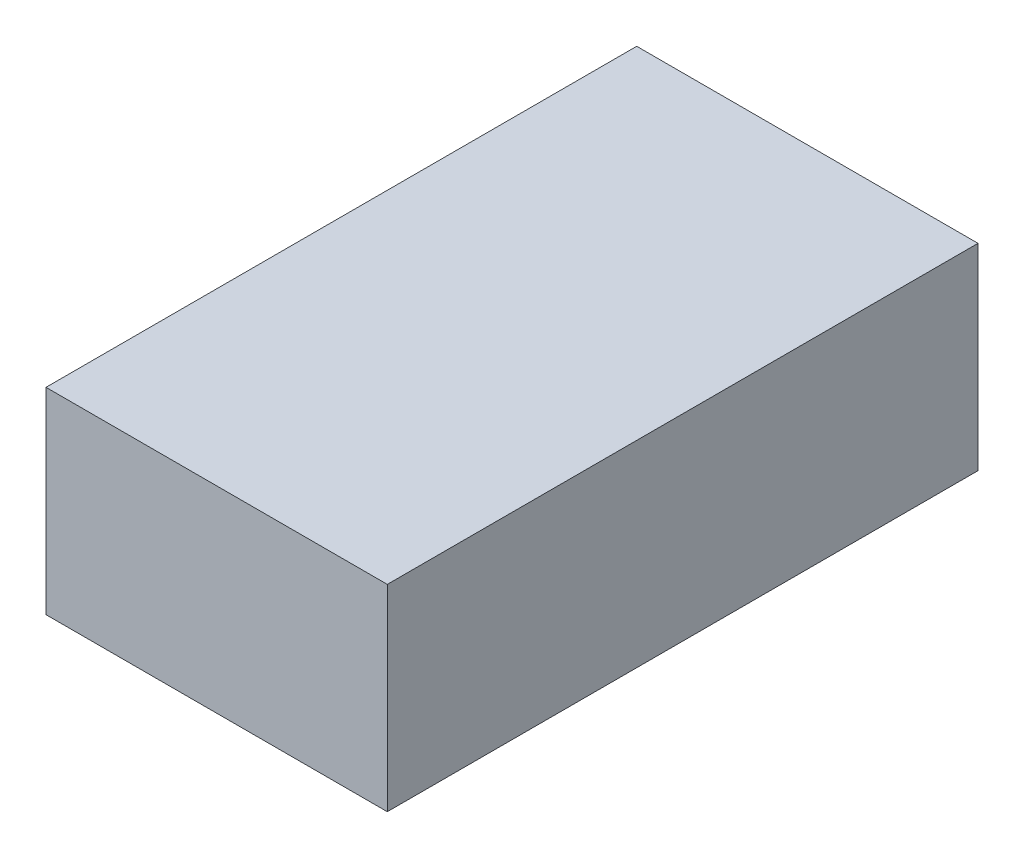
ISO-10303-21;
HEADER;
FILE_DESCRIPTION(('STEP AP214'),'2;1');
FILE_NAME('part.step','',(''),(''),'','','');
FILE_SCHEMA(('AUTOMOTIVE_DESIGN { 1 0 10303 214 1 1 1 1 }'));
ENDSEC;
DATA;
#1=APPLICATION_CONTEXT('core data for automotive mechanical design processes');
#2=APPLICATION_PROTOCOL_DEFINITION('international standard','automotive_design',2000,#1);
#3=PRODUCT_CONTEXT('',#1,'mechanical');
#4=PRODUCT('Part','Part','',(#3));
#5=PRODUCT_RELATED_PRODUCT_CATEGORY('part','',(#4));
#6=PRODUCT_DEFINITION_FORMATION('','',#4);
#7=PRODUCT_DEFINITION_CONTEXT('part definition',#1,'design');
#8=PRODUCT_DEFINITION('design','',#6,#7);
#9=PRODUCT_DEFINITION_SHAPE('','',#8);
#10=(LENGTH_UNIT() NAMED_UNIT(*) SI_UNIT(.MILLI.,.METRE.));
#11=(NAMED_UNIT(*) PLANE_ANGLE_UNIT() SI_UNIT($,.RADIAN.));
#12=(NAMED_UNIT(*) SI_UNIT($,.STERADIAN.) SOLID_ANGLE_UNIT());
#13=UNCERTAINTY_MEASURE_WITH_UNIT(LENGTH_MEASURE(1.E-05),#10,'distance_accuracy_value','');
#14=(GEOMETRIC_REPRESENTATION_CONTEXT(3) GLOBAL_UNCERTAINTY_ASSIGNED_CONTEXT((#13)) GLOBAL_UNIT_ASSIGNED_CONTEXT((#10,
#11,#12)) REPRESENTATION_CONTEXT('',''));
#15=CARTESIAN_POINT('',(0.,0.,0.));
#16=DIRECTION('',(0.,0.,1.));
#17=DIRECTION('',(1.,0.,0.));
#18=AXIS2_PLACEMENT_3D('',#15,#16,#17);
#19=CARTESIAN_POINT('',(0.,-7.5,0.));
#20=DIRECTION('',(0.,1.,0.));
#21=DIRECTION('',(0.,0.,1.));
#22=AXIS2_PLACEMENT_3D('',#19,#20,#21);
#23=PLANE('',#22);
#24=DIRECTION('',(-1.,0.,0.));
#25=VECTOR('',#24,1.);
#26=CARTESIAN_POINT('',(-13.,-7.5,22.5));
#27=LINE('',#26,#25);
#28=CARTESIAN_POINT('',(13.,-7.5,22.5));
#29=VERTEX_POINT('',#28);
#30=CARTESIAN_POINT('',(-13.,-7.5,22.5));
#31=VERTEX_POINT('',#30);
#32=EDGE_CURVE('E80',#29,#31,#27,.T.);
#33=ORIENTED_EDGE('',*,*,#32,.T.);
#34=DIRECTION('',(0.,0.,-1.));
#35=VECTOR('',#34,1.);
#36=CARTESIAN_POINT('',(-13.,-7.5,-22.5));
#37=LINE('',#36,#35);
#38=CARTESIAN_POINT('',(-13.,-7.5,-22.5));
#39=VERTEX_POINT('',#38);
#40=EDGE_CURVE('E67',#31,#39,#37,.T.);
#41=ORIENTED_EDGE('',*,*,#40,.T.);
#42=DIRECTION('',(1.,0.,0.));
#43=VECTOR('',#42,1.);
#44=CARTESIAN_POINT('',(-13.,-7.5,-22.5));
#45=LINE('',#44,#43);
#46=CARTESIAN_POINT('',(13.,-7.5,-22.5));
#47=VERTEX_POINT('',#46);
#48=EDGE_CURVE('E54',#39,#47,#45,.T.);
#49=ORIENTED_EDGE('',*,*,#48,.T.);
#50=DIRECTION('',(0.,0.,1.));
#51=VECTOR('',#50,1.);
#52=CARTESIAN_POINT('',(13.,-7.5,-22.5));
#53=LINE('',#52,#51);
#54=EDGE_CURVE('E19',#47,#29,#53,.T.);
#55=ORIENTED_EDGE('',*,*,#54,.T.);
#56=EDGE_LOOP('',(#33,#41,#49,#55));
#57=FACE_BOUND('',#56,.T.);
#58=ADVANCED_FACE('F16',(#57),#23,.F.);
#59=CARTESIAN_POINT('',(13.,7.5,-22.5));
#60=DIRECTION('',(-1.,0.,0.));
#61=DIRECTION('',(0.,0.,1.));
#62=AXIS2_PLACEMENT_3D('',#59,#60,#61);
#63=PLANE('',#62);
#64=DIRECTION('',(0.,1.,0.));
#65=VECTOR('',#64,1.);
#66=CARTESIAN_POINT('',(13.,7.5,-22.5));
#67=LINE('',#66,#65);
#68=CARTESIAN_POINT('',(13.,7.5,-22.5));
#69=VERTEX_POINT('',#68);
#70=EDGE_CURVE('E60',#47,#69,#67,.T.);
#71=ORIENTED_EDGE('',*,*,#70,.T.);
#72=DIRECTION('',(0.,0.,1.));
#73=VECTOR('',#72,1.);
#74=CARTESIAN_POINT('',(13.,7.5,0.));
#75=LINE('',#74,#73);
#76=CARTESIAN_POINT('',(13.,7.5,22.5));
#77=VERTEX_POINT('',#76);
#78=EDGE_CURVE('E82',#77,#69,#75,.F.);
#79=ORIENTED_EDGE('',*,*,#78,.F.);
#80=DIRECTION('',(0.,1.,0.));
#81=VECTOR('',#80,1.);
#82=CARTESIAN_POINT('',(13.,7.5,22.5));
#83=LINE('',#82,#81);
#84=EDGE_CURVE('E63',#77,#29,#83,.F.);
#85=ORIENTED_EDGE('',*,*,#84,.T.);
#86=ORIENTED_EDGE('',*,*,#54,.F.);
#87=EDGE_LOOP('',(#71,#79,#85,#86));
#88=FACE_BOUND('',#87,.T.);
#89=ADVANCED_FACE('F59',(#88),#63,.F.);
#90=CARTESIAN_POINT('',(-13.,7.5,-22.5));
#91=DIRECTION('',(0.,0.,1.));
#92=DIRECTION('',(1.,0.,0.));
#93=AXIS2_PLACEMENT_3D('',#90,#91,#92);
#94=PLANE('',#93);
#95=DIRECTION('',(0.,1.,0.));
#96=VECTOR('',#95,1.);
#97=CARTESIAN_POINT('',(-13.,7.5,-22.5));
#98=LINE('',#97,#96);
#99=CARTESIAN_POINT('',(-13.,7.5,-22.5));
#100=VERTEX_POINT('',#99);
#101=EDGE_CURVE('E69',#39,#100,#98,.T.);
#102=ORIENTED_EDGE('',*,*,#101,.T.);
#103=DIRECTION('',(1.,0.,0.));
#104=VECTOR('',#103,1.);
#105=CARTESIAN_POINT('',(0.,7.5,-22.5));
#106=LINE('',#105,#104);
#107=EDGE_CURVE('E73',#69,#100,#106,.F.);
#108=ORIENTED_EDGE('',*,*,#107,.F.);
#109=ORIENTED_EDGE('',*,*,#70,.F.);
#110=ORIENTED_EDGE('',*,*,#48,.F.);
#111=EDGE_LOOP('',(#102,#108,#109,#110));
#112=FACE_BOUND('',#111,.T.);
#113=ADVANCED_FACE('F71',(#112),#94,.F.);
#114=CARTESIAN_POINT('',(-13.,7.5,-22.5));
#115=DIRECTION('',(1.,0.,0.));
#116=DIRECTION('',(0.,0.,-1.));
#117=AXIS2_PLACEMENT_3D('',#114,#115,#116);
#118=PLANE('',#117);
#119=DIRECTION('',(0.,1.,0.));
#120=VECTOR('',#119,1.);
#121=CARTESIAN_POINT('',(-13.,7.5,22.5));
#122=LINE('',#121,#120);
#123=CARTESIAN_POINT('',(-13.,7.5,22.5));
#124=VERTEX_POINT('',#123);
#125=EDGE_CURVE('E34',#31,#124,#122,.T.);
#126=ORIENTED_EDGE('',*,*,#125,.T.);
#127=DIRECTION('',(0.,0.,1.));
#128=VECTOR('',#127,1.);
#129=CARTESIAN_POINT('',(-13.,7.5,0.));
#130=LINE('',#129,#128);
#131=EDGE_CURVE('E25',#100,#124,#130,.T.);
#132=ORIENTED_EDGE('',*,*,#131,.F.);
#133=ORIENTED_EDGE('',*,*,#101,.F.);
#134=ORIENTED_EDGE('',*,*,#40,.F.);
#135=EDGE_LOOP('',(#126,#132,#133,#134));
#136=FACE_BOUND('',#135,.T.);
#137=ADVANCED_FACE('F88',(#136),#118,.F.);
#138=CARTESIAN_POINT('',(-13.,7.5,22.5));
#139=DIRECTION('',(0.,0.,-1.));
#140=DIRECTION('',(-1.,0.,0.));
#141=AXIS2_PLACEMENT_3D('',#138,#139,#140);
#142=PLANE('',#141);
#143=ORIENTED_EDGE('',*,*,#84,.F.);
#144=DIRECTION('',(1.,0.,0.));
#145=VECTOR('',#144,1.);
#146=CARTESIAN_POINT('',(0.,7.5,22.5));
#147=LINE('',#146,#145);
#148=EDGE_CURVE('E11',#124,#77,#147,.T.);
#149=ORIENTED_EDGE('',*,*,#148,.F.);
#150=ORIENTED_EDGE('',*,*,#125,.F.);
#151=ORIENTED_EDGE('',*,*,#32,.F.);
#152=EDGE_LOOP('',(#143,#149,#150,#151));
#153=FACE_BOUND('',#152,.T.);
#154=ADVANCED_FACE('F90',(#153),#142,.F.);
#155=CARTESIAN_POINT('',(0.,7.5,0.));
#156=DIRECTION('',(0.,1.,0.));
#157=DIRECTION('',(0.,0.,1.));
#158=AXIS2_PLACEMENT_3D('',#155,#156,#157);
#159=PLANE('',#158);
#160=ORIENTED_EDGE('',*,*,#131,.T.);
#161=ORIENTED_EDGE('',*,*,#148,.T.);
#162=ORIENTED_EDGE('',*,*,#78,.T.);
#163=ORIENTED_EDGE('',*,*,#107,.T.);
#164=EDGE_LOOP('',(#160,#161,#162,#163));
#165=FACE_BOUND('',#164,.T.);
#166=ADVANCED_FACE('F87',(#165),#159,.T.);
#167=CLOSED_SHELL('',(#58,#89,#113,#137,#154,#166));
#168=MANIFOLD_SOLID_BREP('B1',#167);
#169=ADVANCED_BREP_SHAPE_REPRESENTATION('',(#18,#168),#14);
#170=SHAPE_DEFINITION_REPRESENTATION(#9,#169);
ENDSEC;
END-ISO-10303-21;
